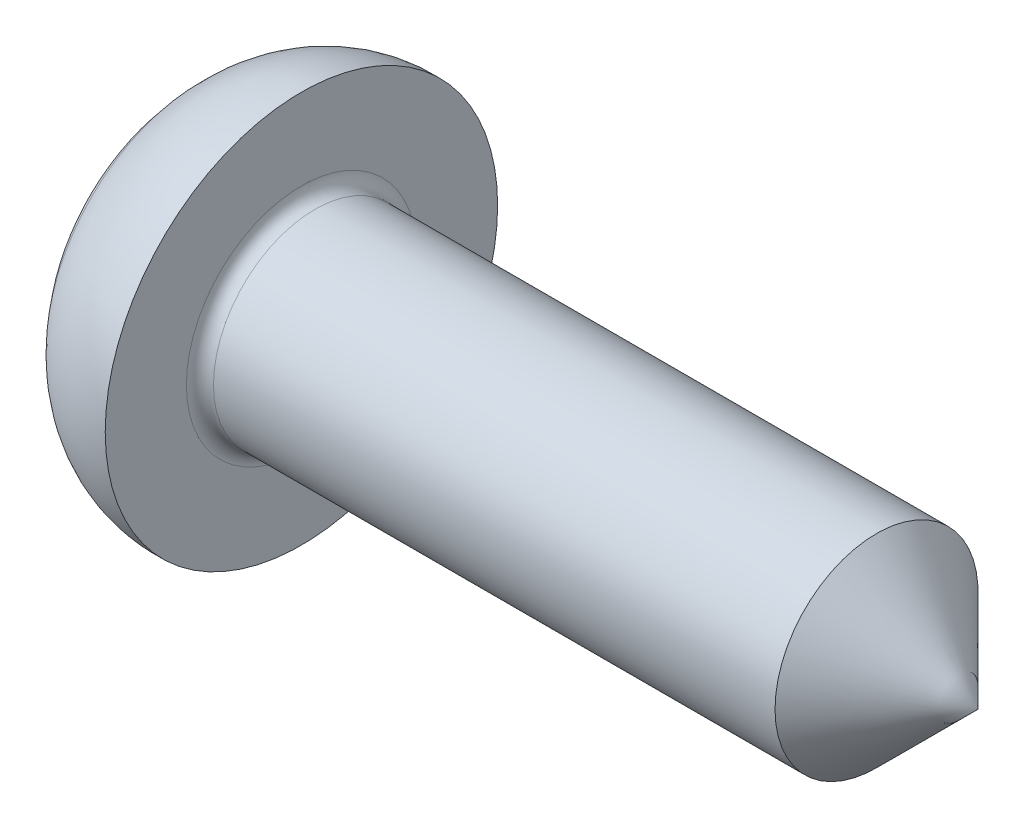
ISO-10303-21;
HEADER;
FILE_DESCRIPTION(('STEP AP214'),'2;1');
FILE_NAME('part.step','',(''),(''),'','','');
FILE_SCHEMA(('AUTOMOTIVE_DESIGN { 1 0 10303 214 1 1 1 1 }'));
ENDSEC;
DATA;
#1=APPLICATION_CONTEXT('core data for automotive mechanical design processes');
#2=APPLICATION_PROTOCOL_DEFINITION('international standard','automotive_design',2000,#1);
#3=PRODUCT_CONTEXT('',#1,'mechanical');
#4=PRODUCT('Part','Part','',(#3));
#5=PRODUCT_RELATED_PRODUCT_CATEGORY('part','',(#4));
#6=PRODUCT_DEFINITION_FORMATION('','',#4);
#7=PRODUCT_DEFINITION_CONTEXT('part definition',#1,'design');
#8=PRODUCT_DEFINITION('design','',#6,#7);
#9=PRODUCT_DEFINITION_SHAPE('','',#8);
#10=(LENGTH_UNIT() NAMED_UNIT(*) SI_UNIT(.MILLI.,.METRE.));
#11=(NAMED_UNIT(*) PLANE_ANGLE_UNIT() SI_UNIT($,.RADIAN.));
#12=(NAMED_UNIT(*) SI_UNIT($,.STERADIAN.) SOLID_ANGLE_UNIT());
#13=UNCERTAINTY_MEASURE_WITH_UNIT(LENGTH_MEASURE(1.E-05),#10,'distance_accuracy_value','');
#14=(GEOMETRIC_REPRESENTATION_CONTEXT(3) GLOBAL_UNCERTAINTY_ASSIGNED_CONTEXT((#13)) GLOBAL_UNIT_ASSIGNED_CONTEXT((#10,
#11,#12)) REPRESENTATION_CONTEXT('',''));
#15=CARTESIAN_POINT('',(0.,0.,0.));
#16=DIRECTION('',(0.,0.,1.));
#17=DIRECTION('',(1.,0.,0.));
#18=AXIS2_PLACEMENT_3D('',#15,#16,#17);
#19=CARTESIAN_POINT('',(-13.6292682926829,0.,0.));
#20=DIRECTION('',(-1.,0.,0.));
#21=DIRECTION('',(0.,0.,1.));
#22=AXIS2_PLACEMENT_3D('',#19,#20,#21);
#23=CYLINDRICAL_SURFACE('',#22,1.5);
#24=CARTESIAN_POINT('',(2.57,0.,0.));
#25=DIRECTION('',(-1.,0.,0.));
#26=DIRECTION('',(0.,0.,1.));
#27=AXIS2_PLACEMENT_3D('',#24,#25,#26);
#28=CIRCLE('',#27,1.5);
#29=CARTESIAN_POINT('',(2.57,0.,1.5));
#30=VERTEX_POINT('',#29);
#31=EDGE_CURVE('E219',#30,#30,#28,.F.);
#32=ORIENTED_EDGE('',*,*,#31,.T.);
#33=EDGE_LOOP('',(#32));
#34=FACE_BOUND('',#33,.T.);
#35=CARTESIAN_POINT('',(10.87,0.,0.));
#36=DIRECTION('',(-1.,0.,0.));
#37=DIRECTION('',(0.,0.,1.));
#38=AXIS2_PLACEMENT_3D('',#35,#36,#37);
#39=CIRCLE('',#38,1.5);
#40=CARTESIAN_POINT('',(10.87,0.,1.5));
#41=VERTEX_POINT('',#40);
#42=EDGE_CURVE('E185',#41,#41,#39,.F.);
#43=ORIENTED_EDGE('',*,*,#42,.F.);
#44=EDGE_LOOP('',(#43));
#45=FACE_BOUND('',#44,.T.);
#46=ADVANCED_FACE('F48',(#34,#45),#23,.T.);
#47=CARTESIAN_POINT('',(3.4,0.,0.));
#48=DIRECTION('',(-1.,0.,0.));
#49=DIRECTION('',(0.,0.,-1.));
#50=AXIS2_PLACEMENT_3D('',#47,#48,#49);
#51=SPHERICAL_SURFACE('',#50,3.4);
#52=CARTESIAN_POINT('',(3.14049033236446,-0.367521799570327,0.));
#53=DIRECTION('',(0.576805601651754,0.816881446663565,0.));
#54=DIRECTION('',(-0.816881446663565,0.576805601651754,0.));
#55=AXIS2_PLACEMENT_3D('',#52,#53,#54);
#56=CIRCLE('',#55,3.37010125355964);
#57=CARTESIAN_POINT('',(0.406090662032796,1.5632565936028,-0.390814148400699));
#58=VERTEX_POINT('',#57);
#59=CARTESIAN_POINT('',(0.406090662032797,1.5632565936028,0.390814148400699));
#60=VERTEX_POINT('',#59);
#61=EDGE_CURVE('E173',#58,#60,#56,.T.);
#62=ORIENTED_EDGE('',*,*,#61,.T.);
#63=CARTESIAN_POINT('',(3.37642841816854,0.,-0.133529825726317));
#64=DIRECTION('',(0.173838938983756,0.,0.984774097594469));
#65=DIRECTION('',(0.98477409759447,0.,-0.173838938983757));
#66=AXIS2_PLACEMENT_3D('',#63,#64,#65);
#67=CIRCLE('',#66,3.39729512497391);
#68=CARTESIAN_POINT('',(0.0605776107523467,0.451806433216427,0.451806433216427));
#69=VERTEX_POINT('',#68);
#70=EDGE_CURVE('E12',#60,#69,#67,.T.);
#71=ORIENTED_EDGE('',*,*,#70,.T.);
#72=CARTESIAN_POINT('',(3.37642841816854,-0.133529825726317,0.));
#73=DIRECTION('',(0.173838938983756,0.98477409759447,0.));
#74=DIRECTION('',(-0.98477409759447,0.173838938983756,0.));
#75=AXIS2_PLACEMENT_3D('',#72,#73,#74);
#76=CIRCLE('',#75,3.39729512497391);
#77=CARTESIAN_POINT('',(0.406090662032797,0.390814148400699,1.5632565936028));
#78=VERTEX_POINT('',#77);
#79=EDGE_CURVE('E56',#69,#78,#76,.T.);
#80=ORIENTED_EDGE('',*,*,#79,.T.);
#81=CARTESIAN_POINT('',(3.14049033236446,0.,-0.367521799570327));
#82=DIRECTION('',(0.576805601651754,0.,0.816881446663565));
#83=DIRECTION('',(0.816881446663565,0.,-0.576805601651754));
#84=AXIS2_PLACEMENT_3D('',#81,#82,#83);
#85=CIRCLE('',#84,3.37010125355964);
#86=CARTESIAN_POINT('',(0.406090662032797,-0.390814148400699,1.5632565936028));
#87=VERTEX_POINT('',#86);
#88=EDGE_CURVE('E188',#78,#87,#85,.T.);
#89=ORIENTED_EDGE('',*,*,#88,.T.);
#90=CARTESIAN_POINT('',(3.37642841816854,0.133529825726317,0.));
#91=DIRECTION('',(0.173838938983756,-0.98477409759447,0.));
#92=DIRECTION('',(0.98477409759447,0.173838938983756,0.));
#93=AXIS2_PLACEMENT_3D('',#90,#91,#92);
#94=CIRCLE('',#93,3.39729512497391);
#95=CARTESIAN_POINT('',(0.0605776107523467,-0.451806433216427,0.451806433216427));
#96=VERTEX_POINT('',#95);
#97=EDGE_CURVE('E107',#87,#96,#94,.T.);
#98=ORIENTED_EDGE('',*,*,#97,.T.);
#99=CARTESIAN_POINT('',(3.37642841816854,0.,-0.133529825726317));
#100=DIRECTION('',(0.173838938983757,0.,0.98477409759447));
#101=DIRECTION('',(0.98477409759447,0.,-0.173838938983757));
#102=AXIS2_PLACEMENT_3D('',#99,#100,#101);
#103=CIRCLE('',#102,3.39729512497391);
#104=CARTESIAN_POINT('',(0.406090662032796,-1.5632565936028,0.390814148400699));
#105=VERTEX_POINT('',#104);
#106=EDGE_CURVE('E117',#96,#105,#103,.T.);
#107=ORIENTED_EDGE('',*,*,#106,.T.);
#108=CARTESIAN_POINT('',(3.14049033236446,0.367521799570327,0.));
#109=DIRECTION('',(0.576805601651754,-0.816881446663565,0.));
#110=DIRECTION('',(0.816881446663565,0.576805601651754,0.));
#111=AXIS2_PLACEMENT_3D('',#108,#109,#110);
#112=CIRCLE('',#111,3.37010125355964);
#113=CARTESIAN_POINT('',(0.406090662032797,-1.5632565936028,-0.390814148400699));
#114=VERTEX_POINT('',#113);
#115=EDGE_CURVE('E125',#105,#114,#112,.T.);
#116=ORIENTED_EDGE('',*,*,#115,.T.);
#117=CARTESIAN_POINT('',(3.37642841816854,0.,0.133529825726317));
#118=DIRECTION('',(0.173838938983756,0.,-0.984774097594469));
#119=DIRECTION('',(-0.98477409759447,0.,-0.173838938983757));
#120=AXIS2_PLACEMENT_3D('',#117,#118,#119);
#121=CIRCLE('',#120,3.39729512497391);
#122=CARTESIAN_POINT('',(0.0605776107523467,-0.451806433216427,-0.451806433216427));
#123=VERTEX_POINT('',#122);
#124=EDGE_CURVE('E133',#114,#123,#121,.T.);
#125=ORIENTED_EDGE('',*,*,#124,.T.);
#126=CARTESIAN_POINT('',(3.37642841816854,0.133529825726317,0.));
#127=DIRECTION('',(0.173838938983756,-0.98477409759447,0.));
#128=DIRECTION('',(0.98477409759447,0.173838938983756,0.));
#129=AXIS2_PLACEMENT_3D('',#126,#127,#128);
#130=CIRCLE('',#129,3.39729512497391);
#131=CARTESIAN_POINT('',(0.406090662032796,-0.390814148400699,-1.5632565936028));
#132=VERTEX_POINT('',#131);
#133=EDGE_CURVE('E141',#123,#132,#130,.T.);
#134=ORIENTED_EDGE('',*,*,#133,.T.);
#135=CARTESIAN_POINT('',(3.14049033236446,0.,0.367521799570327));
#136=DIRECTION('',(0.576805601651754,0.,-0.816881446663565));
#137=DIRECTION('',(-0.816881446663565,0.,-0.576805601651754));
#138=AXIS2_PLACEMENT_3D('',#135,#136,#137);
#139=CIRCLE('',#138,3.37010125355964);
#140=CARTESIAN_POINT('',(0.406090662032797,0.390814148400699,-1.5632565936028));
#141=VERTEX_POINT('',#140);
#142=EDGE_CURVE('E149',#132,#141,#139,.T.);
#143=ORIENTED_EDGE('',*,*,#142,.T.);
#144=CARTESIAN_POINT('',(3.37642841816854,-0.133529825726317,0.));
#145=DIRECTION('',(0.173838938983756,0.98477409759447,0.));
#146=DIRECTION('',(-0.98477409759447,0.173838938983756,0.));
#147=AXIS2_PLACEMENT_3D('',#144,#145,#146);
#148=CIRCLE('',#147,3.39729512497391);
#149=CARTESIAN_POINT('',(0.0605776107523467,0.451806433216427,-0.451806433216427));
#150=VERTEX_POINT('',#149);
#151=EDGE_CURVE('E157',#141,#150,#148,.T.);
#152=ORIENTED_EDGE('',*,*,#151,.T.);
#153=CARTESIAN_POINT('',(3.37642841816854,0.,0.133529825726317));
#154=DIRECTION('',(0.173838938983757,0.,-0.98477409759447));
#155=DIRECTION('',(-0.98477409759447,0.,-0.173838938983757));
#156=AXIS2_PLACEMENT_3D('',#153,#154,#155);
#157=CIRCLE('',#156,3.39729512497391);
#158=EDGE_CURVE('E165',#150,#58,#157,.T.);
#159=ORIENTED_EDGE('',*,*,#158,.T.);
#160=EDGE_LOOP('',(#62,#71,#80,#89,#98,#107,#116,#125,#134,#143,#152,#159));
#161=FACE_BOUND('',#160,.T.);
#162=CARTESIAN_POINT('',(0.869770134856255,0.,0.));
#163=DIRECTION('',(-1.,0.,0.));
#164=DIRECTION('',(0.,0.,1.));
#165=AXIS2_PLACEMENT_3D('',#162,#163,#164);
#166=CIRCLE('',#165,2.27110916283975);
#167=CARTESIAN_POINT('',(0.869770134856255,0.,2.27110916283975));
#168=VERTEX_POINT('',#167);
#169=EDGE_CURVE('E213',#168,#168,#166,.T.);
#170=ORIENTED_EDGE('',*,*,#169,.T.);
#171=EDGE_LOOP('',(#170));
#172=FACE_BOUND('',#171,.T.);
#173=ADVANCED_FACE('F234',(#161,#172),#51,.T.);
#174=CARTESIAN_POINT('',(2.28372211831894,0.,0.));
#175=DIRECTION('',(-1.,0.,0.));
#176=DIRECTION('',(0.,0.,1.));
#177=AXIS2_PLACEMENT_3D('',#174,#175,#176);
#178=DEGENERATE_TOROIDAL_SURFACE('',#177,1.00195992478224,1.9,.T.);
#179=ORIENTED_EDGE('',*,*,#169,.F.);
#180=EDGE_LOOP('',(#179));
#181=FACE_BOUND('',#180,.T.);
#182=CARTESIAN_POINT('',(2.37,0.,0.));
#183=DIRECTION('',(-1.,0.,0.));
#184=DIRECTION('',(0.,0.,1.));
#185=AXIS2_PLACEMENT_3D('',#182,#183,#184);
#186=CIRCLE('',#185,2.9);
#187=CARTESIAN_POINT('',(2.37,0.,2.9));
#188=VERTEX_POINT('',#187);
#189=EDGE_CURVE('E209',#188,#188,#186,.T.);
#190=ORIENTED_EDGE('',*,*,#189,.T.);
#191=EDGE_LOOP('',(#190));
#192=FACE_BOUND('',#191,.T.);
#193=ADVANCED_FACE('F237',(#181,#192),#178,.T.);
#194=CARTESIAN_POINT('',(2.37,0.,-1.5));
#195=DIRECTION('',(-1.,0.,0.));
#196=DIRECTION('',(0.,0.,1.));
#197=AXIS2_PLACEMENT_3D('',#194,#195,#196);
#198=PLANE('',#197);
#199=CARTESIAN_POINT('',(2.37,0.,0.));
#200=DIRECTION('',(-1.,0.,0.));
#201=DIRECTION('',(0.,0.,1.));
#202=AXIS2_PLACEMENT_3D('',#199,#200,#201);
#203=CIRCLE('',#202,1.7);
#204=CARTESIAN_POINT('',(2.37,0.,1.7));
#205=VERTEX_POINT('',#204);
#206=EDGE_CURVE('E216',#205,#205,#203,.T.);
#207=ORIENTED_EDGE('',*,*,#206,.T.);
#208=EDGE_LOOP('',(#207));
#209=FACE_BOUND('',#208,.T.);
#210=ORIENTED_EDGE('',*,*,#189,.F.);
#211=EDGE_LOOP('',(#210));
#212=FACE_BOUND('',#211,.T.);
#213=ADVANCED_FACE('F242',(#209,#212),#198,.F.);
#214=CARTESIAN_POINT('',(2.57,0.,0.));
#215=DIRECTION('',(-1.,0.,0.));
#216=DIRECTION('',(0.,0.,1.));
#217=AXIS2_PLACEMENT_3D('',#214,#215,#216);
#218=TOROIDAL_SURFACE('',#217,1.7,0.2);
#219=ORIENTED_EDGE('',*,*,#31,.F.);
#220=EDGE_LOOP('',(#219));
#221=FACE_BOUND('',#220,.T.);
#222=ORIENTED_EDGE('',*,*,#206,.F.);
#223=EDGE_LOOP('',(#222));
#224=FACE_BOUND('',#223,.T.);
#225=ADVANCED_FACE('F50',(#221,#224),#218,.F.);
#226=CARTESIAN_POINT('',(-8.62999999999993,0.,0.));
#227=DIRECTION('',(-1.,0.,0.));
#228=DIRECTION('',(0.,0.,1.));
#229=AXIS2_PLACEMENT_3D('',#226,#227,#228);
#230=CONICAL_SURFACE('',#229,21.,0.78539816339745);
#231=CARTESIAN_POINT('',(12.37,0.,0.));
#232=VERTEX_POINT('',#231);
#233=VERTEX_LOOP('',#232);
#234=FACE_BOUND('',#233,.T.);
#235=ORIENTED_EDGE('',*,*,#42,.T.);
#236=EDGE_LOOP('',(#235));
#237=FACE_BOUND('',#236,.T.);
#238=ADVANCED_FACE('F252',(#234,#237),#230,.T.);
#239=CARTESIAN_POINT('',(0.,1.85,0.4625));
#240=DIRECTION('',(0.173838938983756,0.,0.984774097594469));
#241=DIRECTION('',(0.98477409759447,0.,-0.173838938983757));
#242=AXIS2_PLACEMENT_3D('',#239,#240,#241);
#243=PLANE('',#242);
#244=DIRECTION('',(-0.808518513061452,0.570900476780033,0.142725119195008));
#245=VECTOR('',#244,1.);
#246=CARTESIAN_POINT('',(2.62,0.,0.));
#247=LINE('',#246,#245);
#248=CARTESIAN_POINT('',(2.62,0.,0.));
#249=VERTEX_POINT('',#248);
#250=EDGE_CURVE('E171',#249,#60,#247,.T.);
#251=ORIENTED_EDGE('',*,*,#250,.F.);
#252=DIRECTION('',(-0.970223151174685,0.17127030817492,0.17127030817492));
#253=VECTOR('',#252,1.);
#254=CARTESIAN_POINT('',(2.62,0.,0.));
#255=LINE('',#254,#253);
#256=EDGE_CURVE('E179',#249,#69,#255,.T.);
#257=ORIENTED_EDGE('',*,*,#256,.T.);
#258=ORIENTED_EDGE('',*,*,#70,.F.);
#259=EDGE_LOOP('',(#251,#257,#258));
#260=FACE_BOUND('',#259,.T.);
#261=ADVANCED_FACE('F178',(#260),#243,.F.);
#262=CARTESIAN_POINT('',(0.,0.4625,0.4625));
#263=DIRECTION('',(0.173838938983756,0.98477409759447,0.));
#264=DIRECTION('',(-0.98477409759447,0.173838938983756,0.));
#265=AXIS2_PLACEMENT_3D('',#262,#263,#264);
#266=PLANE('',#265);
#267=ORIENTED_EDGE('',*,*,#256,.F.);
#268=DIRECTION('',(-0.808518513061452,0.142725119195008,0.570900476780033));
#269=VECTOR('',#268,1.);
#270=CARTESIAN_POINT('',(2.62,0.,0.));
#271=LINE('',#270,#269);
#272=EDGE_CURVE('E109',#249,#78,#271,.T.);
#273=ORIENTED_EDGE('',*,*,#272,.T.);
#274=ORIENTED_EDGE('',*,*,#79,.F.);
#275=EDGE_LOOP('',(#267,#273,#274));
#276=FACE_BOUND('',#275,.T.);
#277=ADVANCED_FACE('F183',(#276),#266,.F.);
#278=CARTESIAN_POINT('',(0.,1.85,-0.4625));
#279=DIRECTION('',(0.576805601651754,0.816881446663565,0.));
#280=DIRECTION('',(-0.816881446663565,0.576805601651754,0.));
#281=AXIS2_PLACEMENT_3D('',#278,#279,#280);
#282=PLANE('',#281);
#283=DIRECTION('',(-0.808518513061452,0.570900476780033,-0.142725119195008));
#284=VECTOR('',#283,1.);
#285=CARTESIAN_POINT('',(2.62,0.,0.));
#286=LINE('',#285,#284);
#287=EDGE_CURVE('E163',#249,#58,#286,.T.);
#288=ORIENTED_EDGE('',*,*,#287,.F.);
#289=ORIENTED_EDGE('',*,*,#250,.T.);
#290=ORIENTED_EDGE('',*,*,#61,.F.);
#291=EDGE_LOOP('',(#288,#289,#290));
#292=FACE_BOUND('',#291,.T.);
#293=ADVANCED_FACE('F170',(#292),#282,.F.);
#294=CARTESIAN_POINT('',(0.,0.4625,-0.4625));
#295=DIRECTION('',(0.173838938983757,0.,-0.98477409759447));
#296=DIRECTION('',(-0.98477409759447,0.,-0.173838938983757));
#297=AXIS2_PLACEMENT_3D('',#294,#295,#296);
#298=PLANE('',#297);
#299=DIRECTION('',(-0.970223151174685,0.17127030817492,-0.17127030817492));
#300=VECTOR('',#299,1.);
#301=CARTESIAN_POINT('',(2.62,0.,0.));
#302=LINE('',#301,#300);
#303=EDGE_CURVE('E155',#249,#150,#302,.T.);
#304=ORIENTED_EDGE('',*,*,#303,.F.);
#305=ORIENTED_EDGE('',*,*,#287,.T.);
#306=ORIENTED_EDGE('',*,*,#158,.F.);
#307=EDGE_LOOP('',(#304,#305,#306));
#308=FACE_BOUND('',#307,.T.);
#309=ADVANCED_FACE('F162',(#308),#298,.F.);
#310=CARTESIAN_POINT('',(0.,0.4625,-1.85));
#311=DIRECTION('',(0.173838938983756,0.98477409759447,0.));
#312=DIRECTION('',(-0.98477409759447,0.173838938983756,0.));
#313=AXIS2_PLACEMENT_3D('',#310,#311,#312);
#314=PLANE('',#313);
#315=DIRECTION('',(-0.808518513061452,0.142725119195008,-0.570900476780033));
#316=VECTOR('',#315,1.);
#317=CARTESIAN_POINT('',(2.62,0.,0.));
#318=LINE('',#317,#316);
#319=EDGE_CURVE('E147',#249,#141,#318,.T.);
#320=ORIENTED_EDGE('',*,*,#319,.F.);
#321=ORIENTED_EDGE('',*,*,#303,.T.);
#322=ORIENTED_EDGE('',*,*,#151,.F.);
#323=EDGE_LOOP('',(#320,#321,#322));
#324=FACE_BOUND('',#323,.T.);
#325=ADVANCED_FACE('F154',(#324),#314,.F.);
#326=CARTESIAN_POINT('',(0.,-0.4625,-1.85));
#327=DIRECTION('',(0.576805601651754,0.,-0.816881446663565));
#328=DIRECTION('',(-0.816881446663565,0.,-0.576805601651754));
#329=AXIS2_PLACEMENT_3D('',#326,#327,#328);
#330=PLANE('',#329);
#331=DIRECTION('',(-0.808518513061452,-0.142725119195008,-0.570900476780033));
#332=VECTOR('',#331,1.);
#333=CARTESIAN_POINT('',(2.62,0.,0.));
#334=LINE('',#333,#332);
#335=EDGE_CURVE('E139',#249,#132,#334,.T.);
#336=ORIENTED_EDGE('',*,*,#335,.F.);
#337=ORIENTED_EDGE('',*,*,#319,.T.);
#338=ORIENTED_EDGE('',*,*,#142,.F.);
#339=EDGE_LOOP('',(#336,#337,#338));
#340=FACE_BOUND('',#339,.T.);
#341=ADVANCED_FACE('F146',(#340),#330,.F.);
#342=CARTESIAN_POINT('',(0.,-0.4625,-0.4625));
#343=DIRECTION('',(0.173838938983756,-0.98477409759447,0.));
#344=DIRECTION('',(0.98477409759447,0.173838938983756,0.));
#345=AXIS2_PLACEMENT_3D('',#342,#343,#344);
#346=PLANE('',#345);
#347=DIRECTION('',(-0.970223151174685,-0.17127030817492,-0.17127030817492));
#348=VECTOR('',#347,1.);
#349=CARTESIAN_POINT('',(2.62,0.,0.));
#350=LINE('',#349,#348);
#351=EDGE_CURVE('E131',#249,#123,#350,.T.);
#352=ORIENTED_EDGE('',*,*,#351,.F.);
#353=ORIENTED_EDGE('',*,*,#335,.T.);
#354=ORIENTED_EDGE('',*,*,#133,.F.);
#355=EDGE_LOOP('',(#352,#353,#354));
#356=FACE_BOUND('',#355,.T.);
#357=ADVANCED_FACE('F138',(#356),#346,.F.);
#358=CARTESIAN_POINT('',(0.,-1.85,-0.4625));
#359=DIRECTION('',(0.173838938983756,0.,-0.984774097594469));
#360=DIRECTION('',(-0.98477409759447,0.,-0.173838938983757));
#361=AXIS2_PLACEMENT_3D('',#358,#359,#360);
#362=PLANE('',#361);
#363=DIRECTION('',(-0.808518513061452,-0.570900476780033,-0.142725119195008));
#364=VECTOR('',#363,1.);
#365=CARTESIAN_POINT('',(2.62,0.,0.));
#366=LINE('',#365,#364);
#367=EDGE_CURVE('E123',#249,#114,#366,.T.);
#368=ORIENTED_EDGE('',*,*,#367,.F.);
#369=ORIENTED_EDGE('',*,*,#351,.T.);
#370=ORIENTED_EDGE('',*,*,#124,.F.);
#371=EDGE_LOOP('',(#368,#369,#370));
#372=FACE_BOUND('',#371,.T.);
#373=ADVANCED_FACE('F130',(#372),#362,.F.);
#374=CARTESIAN_POINT('',(0.,-1.85,0.4625));
#375=DIRECTION('',(0.576805601651754,-0.816881446663565,0.));
#376=DIRECTION('',(0.816881446663565,0.576805601651754,0.));
#377=AXIS2_PLACEMENT_3D('',#374,#375,#376);
#378=PLANE('',#377);
#379=DIRECTION('',(-0.808518513061452,-0.570900476780033,0.142725119195008));
#380=VECTOR('',#379,1.);
#381=CARTESIAN_POINT('',(2.62,0.,0.));
#382=LINE('',#381,#380);
#383=EDGE_CURVE('E115',#249,#105,#382,.T.);
#384=ORIENTED_EDGE('',*,*,#383,.F.);
#385=ORIENTED_EDGE('',*,*,#367,.T.);
#386=ORIENTED_EDGE('',*,*,#115,.F.);
#387=EDGE_LOOP('',(#384,#385,#386));
#388=FACE_BOUND('',#387,.T.);
#389=ADVANCED_FACE('F122',(#388),#378,.F.);
#390=CARTESIAN_POINT('',(0.,-0.4625,0.4625));
#391=DIRECTION('',(0.173838938983757,0.,0.98477409759447));
#392=DIRECTION('',(0.98477409759447,0.,-0.173838938983757));
#393=AXIS2_PLACEMENT_3D('',#390,#391,#392);
#394=PLANE('',#393);
#395=DIRECTION('',(-0.970223151174685,-0.17127030817492,0.17127030817492));
#396=VECTOR('',#395,1.);
#397=CARTESIAN_POINT('',(2.62,0.,0.));
#398=LINE('',#397,#396);
#399=EDGE_CURVE('E105',#249,#96,#398,.T.);
#400=ORIENTED_EDGE('',*,*,#399,.F.);
#401=ORIENTED_EDGE('',*,*,#383,.T.);
#402=ORIENTED_EDGE('',*,*,#106,.F.);
#403=EDGE_LOOP('',(#400,#401,#402));
#404=FACE_BOUND('',#403,.T.);
#405=ADVANCED_FACE('F114',(#404),#394,.F.);
#406=CARTESIAN_POINT('',(0.,-0.4625,1.85));
#407=DIRECTION('',(0.173838938983756,-0.98477409759447,0.));
#408=DIRECTION('',(0.98477409759447,0.173838938983756,0.));
#409=AXIS2_PLACEMENT_3D('',#406,#407,#408);
#410=PLANE('',#409);
#411=DIRECTION('',(-0.808518513061452,-0.142725119195008,0.570900476780033));
#412=VECTOR('',#411,1.);
#413=CARTESIAN_POINT('',(2.62,0.,0.));
#414=LINE('',#413,#412);
#415=EDGE_CURVE('E63',#249,#87,#414,.T.);
#416=ORIENTED_EDGE('',*,*,#415,.F.);
#417=ORIENTED_EDGE('',*,*,#399,.T.);
#418=ORIENTED_EDGE('',*,*,#97,.F.);
#419=EDGE_LOOP('',(#416,#417,#418));
#420=FACE_BOUND('',#419,.T.);
#421=ADVANCED_FACE('F104',(#420),#410,.F.);
#422=CARTESIAN_POINT('',(0.,0.4625,1.85));
#423=DIRECTION('',(0.576805601651754,0.,0.816881446663565));
#424=DIRECTION('',(0.816881446663565,0.,-0.576805601651754));
#425=AXIS2_PLACEMENT_3D('',#422,#423,#424);
#426=PLANE('',#425);
#427=ORIENTED_EDGE('',*,*,#272,.F.);
#428=ORIENTED_EDGE('',*,*,#415,.T.);
#429=ORIENTED_EDGE('',*,*,#88,.F.);
#430=EDGE_LOOP('',(#427,#428,#429));
#431=FACE_BOUND('',#430,.T.);
#432=ADVANCED_FACE('F187',(#431),#426,.F.);
#433=CLOSED_SHELL('',(#46,#173,#193,#213,#225,#238,#261,#277,#293,#309,#325,#341,#357,#373,#389,
#405,#421,#432));
#434=MANIFOLD_SOLID_BREP('B2',#433);
#435=ADVANCED_BREP_SHAPE_REPRESENTATION('',(#18,#434),#14);
#436=SHAPE_DEFINITION_REPRESENTATION(#9,#435);
ENDSEC;
END-ISO-10303-21;
